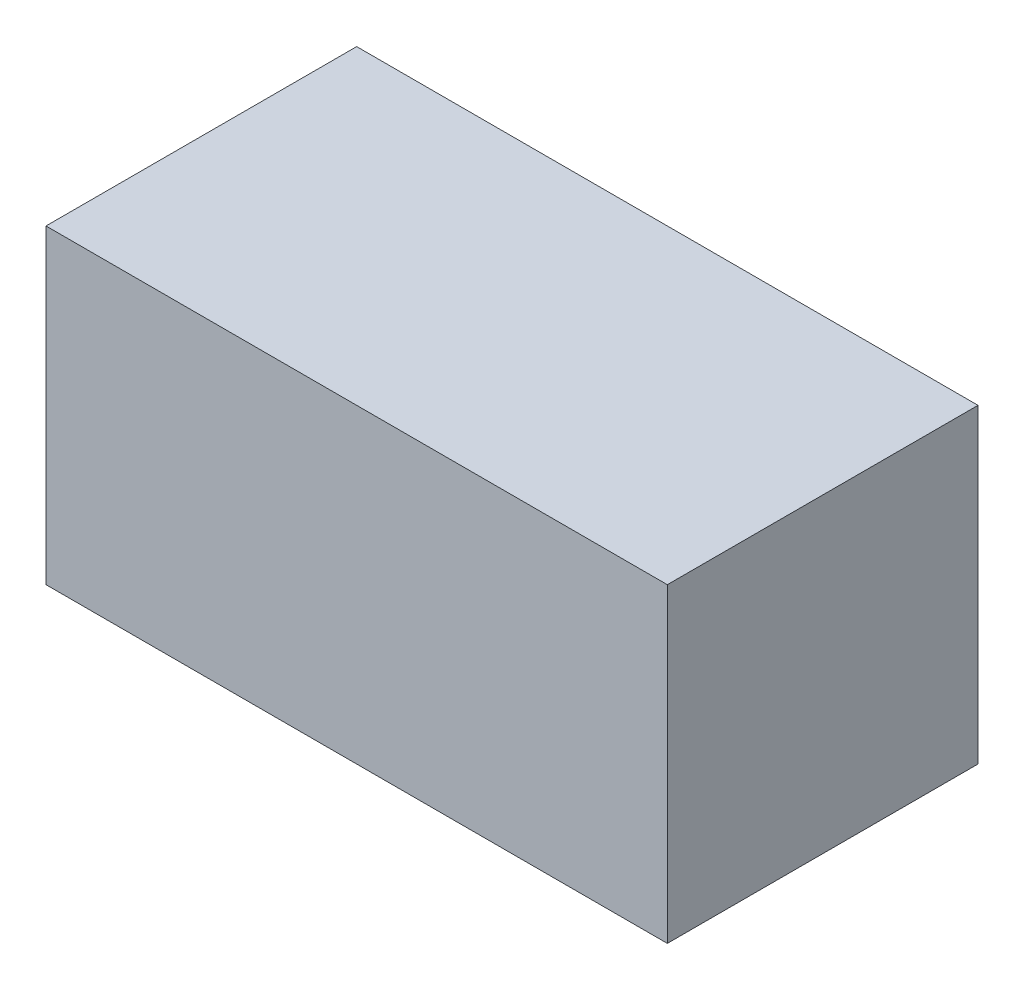
ISO-10303-21;
HEADER;
FILE_DESCRIPTION(('STEP AP214'),'2;1');
FILE_NAME('part.step','',(''),(''),'','','');
FILE_SCHEMA(('AUTOMOTIVE_DESIGN { 1 0 10303 214 1 1 1 1 }'));
ENDSEC;
DATA;
#1=APPLICATION_CONTEXT('core data for automotive mechanical design processes');
#2=APPLICATION_PROTOCOL_DEFINITION('international standard','automotive_design',2000,#1);
#3=PRODUCT_CONTEXT('',#1,'mechanical');
#4=PRODUCT('Part','Part','',(#3));
#5=PRODUCT_RELATED_PRODUCT_CATEGORY('part','',(#4));
#6=PRODUCT_DEFINITION_FORMATION('','',#4);
#7=PRODUCT_DEFINITION_CONTEXT('part definition',#1,'design');
#8=PRODUCT_DEFINITION('design','',#6,#7);
#9=PRODUCT_DEFINITION_SHAPE('','',#8);
#10=(LENGTH_UNIT() NAMED_UNIT(*) SI_UNIT(.MILLI.,.METRE.));
#11=(NAMED_UNIT(*) PLANE_ANGLE_UNIT() SI_UNIT($,.RADIAN.));
#12=(NAMED_UNIT(*) SI_UNIT($,.STERADIAN.) SOLID_ANGLE_UNIT());
#13=UNCERTAINTY_MEASURE_WITH_UNIT(LENGTH_MEASURE(1.E-05),#10,'distance_accuracy_value','');
#14=(GEOMETRIC_REPRESENTATION_CONTEXT(3) GLOBAL_UNCERTAINTY_ASSIGNED_CONTEXT((#13)) GLOBAL_UNIT_ASSIGNED_CONTEXT((#10,
#11,#12)) REPRESENTATION_CONTEXT('',''));
#15=CARTESIAN_POINT('',(0.,0.,0.));
#16=DIRECTION('',(0.,0.,1.));
#17=DIRECTION('',(1.,0.,0.));
#18=AXIS2_PLACEMENT_3D('',#15,#16,#17);
#19=CARTESIAN_POINT('',(-6.35,-6.35,-3.175));
#20=DIRECTION('',(-1.,0.,0.));
#21=DIRECTION('',(0.,0.,1.));
#22=AXIS2_PLACEMENT_3D('',#19,#20,#21);
#23=PLANE('',#22);
#24=DIRECTION('',(0.,0.,1.));
#25=VECTOR('',#24,1.);
#26=CARTESIAN_POINT('',(-6.35,0.,-3.175));
#27=LINE('',#26,#25);
#28=CARTESIAN_POINT('',(-6.35,0.,-3.175));
#29=VERTEX_POINT('',#28);
#30=CARTESIAN_POINT('',(-6.35,0.,3.175));
#31=VERTEX_POINT('',#30);
#32=EDGE_CURVE('E99',#29,#31,#27,.T.);
#33=ORIENTED_EDGE('',*,*,#32,.F.);
#34=DIRECTION('',(0.,1.,0.));
#35=VECTOR('',#34,1.);
#36=CARTESIAN_POINT('',(-6.35,-6.35,-3.175));
#37=LINE('',#36,#35);
#38=CARTESIAN_POINT('',(-6.35,-6.35,-3.175));
#39=VERTEX_POINT('',#38);
#40=EDGE_CURVE('E11',#39,#29,#37,.T.);
#41=ORIENTED_EDGE('',*,*,#40,.F.);
#42=DIRECTION('',(0.,0.,1.));
#43=VECTOR('',#42,1.);
#44=CARTESIAN_POINT('',(-6.35,-6.35,-3.175));
#45=LINE('',#44,#43);
#46=CARTESIAN_POINT('',(-6.35,-6.35,3.175));
#47=VERTEX_POINT('',#46);
#48=EDGE_CURVE('E93',#39,#47,#45,.T.);
#49=ORIENTED_EDGE('',*,*,#48,.T.);
#50=DIRECTION('',(0.,1.,0.));
#51=VECTOR('',#50,1.);
#52=CARTESIAN_POINT('',(-6.35,-6.35,3.175));
#53=LINE('',#52,#51);
#54=EDGE_CURVE('E38',#47,#31,#53,.T.);
#55=ORIENTED_EDGE('',*,*,#54,.T.);
#56=EDGE_LOOP('',(#33,#41,#49,#55));
#57=FACE_BOUND('',#56,.T.);
#58=ADVANCED_FACE('F35',(#57),#23,.T.);
#59=CARTESIAN_POINT('',(-6.35,-6.35,-3.175));
#60=DIRECTION('',(0.,0.,-1.));
#61=DIRECTION('',(-1.,0.,0.));
#62=AXIS2_PLACEMENT_3D('',#59,#60,#61);
#63=PLANE('',#62);
#64=DIRECTION('',(-1.,0.,0.));
#65=VECTOR('',#64,1.);
#66=CARTESIAN_POINT('',(-6.35,0.,-3.175));
#67=LINE('',#66,#65);
#68=CARTESIAN_POINT('',(6.35,0.,-3.175));
#69=VERTEX_POINT('',#68);
#70=EDGE_CURVE('E95',#69,#29,#67,.T.);
#71=ORIENTED_EDGE('',*,*,#70,.F.);
#72=DIRECTION('',(0.,1.,0.));
#73=VECTOR('',#72,1.);
#74=CARTESIAN_POINT('',(6.35,-6.35,-3.175));
#75=LINE('',#74,#73);
#76=CARTESIAN_POINT('',(6.35,-6.35,-3.175));
#77=VERTEX_POINT('',#76);
#78=EDGE_CURVE('E44',#77,#69,#75,.T.);
#79=ORIENTED_EDGE('',*,*,#78,.F.);
#80=DIRECTION('',(-1.,0.,0.));
#81=VECTOR('',#80,1.);
#82=CARTESIAN_POINT('',(-6.35,-6.35,-3.175));
#83=LINE('',#82,#81);
#84=EDGE_CURVE('E90',#77,#39,#83,.T.);
#85=ORIENTED_EDGE('',*,*,#84,.T.);
#86=ORIENTED_EDGE('',*,*,#40,.T.);
#87=EDGE_LOOP('',(#71,#79,#85,#86));
#88=FACE_BOUND('',#87,.T.);
#89=ADVANCED_FACE('F109',(#88),#63,.T.);
#90=CARTESIAN_POINT('',(6.35,-6.35,-3.175));
#91=DIRECTION('',(1.,0.,0.));
#92=DIRECTION('',(0.,0.,-1.));
#93=AXIS2_PLACEMENT_3D('',#90,#91,#92);
#94=PLANE('',#93);
#95=DIRECTION('',(0.,0.,-1.));
#96=VECTOR('',#95,1.);
#97=CARTESIAN_POINT('',(6.35,0.,-3.175));
#98=LINE('',#97,#96);
#99=CARTESIAN_POINT('',(6.35,0.,3.175));
#100=VERTEX_POINT('',#99);
#101=EDGE_CURVE('E85',#100,#69,#98,.T.);
#102=ORIENTED_EDGE('',*,*,#101,.F.);
#103=DIRECTION('',(0.,1.,0.));
#104=VECTOR('',#103,1.);
#105=CARTESIAN_POINT('',(6.35,-6.35,3.175));
#106=LINE('',#105,#104);
#107=CARTESIAN_POINT('',(6.35,-6.35,3.175));
#108=VERTEX_POINT('',#107);
#109=EDGE_CURVE('E80',#108,#100,#106,.T.);
#110=ORIENTED_EDGE('',*,*,#109,.F.);
#111=DIRECTION('',(0.,0.,-1.));
#112=VECTOR('',#111,1.);
#113=CARTESIAN_POINT('',(6.35,-6.35,-3.175));
#114=LINE('',#113,#112);
#115=EDGE_CURVE('E83',#108,#77,#114,.T.);
#116=ORIENTED_EDGE('',*,*,#115,.T.);
#117=ORIENTED_EDGE('',*,*,#78,.T.);
#118=EDGE_LOOP('',(#102,#110,#116,#117));
#119=FACE_BOUND('',#118,.T.);
#120=ADVANCED_FACE('F82',(#119),#94,.T.);
#121=CARTESIAN_POINT('',(-6.35,-6.35,3.175));
#122=DIRECTION('',(0.,0.,1.));
#123=DIRECTION('',(1.,0.,0.));
#124=AXIS2_PLACEMENT_3D('',#121,#122,#123);
#125=PLANE('',#124);
#126=DIRECTION('',(1.,0.,0.));
#127=VECTOR('',#126,1.);
#128=CARTESIAN_POINT('',(-6.35,0.,3.175));
#129=LINE('',#128,#127);
#130=EDGE_CURVE('E102',#31,#100,#129,.T.);
#131=ORIENTED_EDGE('',*,*,#130,.F.);
#132=ORIENTED_EDGE('',*,*,#54,.F.);
#133=DIRECTION('',(1.,0.,0.));
#134=VECTOR('',#133,1.);
#135=CARTESIAN_POINT('',(-6.35,-6.35,3.175));
#136=LINE('',#135,#134);
#137=EDGE_CURVE('E89',#47,#108,#136,.T.);
#138=ORIENTED_EDGE('',*,*,#137,.T.);
#139=ORIENTED_EDGE('',*,*,#109,.T.);
#140=EDGE_LOOP('',(#131,#132,#138,#139));
#141=FACE_BOUND('',#140,.T.);
#142=ADVANCED_FACE('F92',(#141),#125,.T.);
#143=CARTESIAN_POINT('',(-6.35,-6.35,3.175));
#144=DIRECTION('',(0.,1.,0.));
#145=DIRECTION('',(0.,0.,1.));
#146=AXIS2_PLACEMENT_3D('',#143,#144,#145);
#147=PLANE('',#146);
#148=ORIENTED_EDGE('',*,*,#48,.F.);
#149=ORIENTED_EDGE('',*,*,#84,.F.);
#150=ORIENTED_EDGE('',*,*,#115,.F.);
#151=ORIENTED_EDGE('',*,*,#137,.F.);
#152=EDGE_LOOP('',(#148,#149,#150,#151));
#153=FACE_BOUND('',#152,.T.);
#154=ADVANCED_FACE('F88',(#153),#147,.F.);
#155=CARTESIAN_POINT('',(-6.35,0.,3.175));
#156=DIRECTION('',(0.,1.,0.));
#157=DIRECTION('',(0.,0.,1.));
#158=AXIS2_PLACEMENT_3D('',#155,#156,#157);
#159=PLANE('',#158);
#160=ORIENTED_EDGE('',*,*,#32,.T.);
#161=ORIENTED_EDGE('',*,*,#130,.T.);
#162=ORIENTED_EDGE('',*,*,#101,.T.);
#163=ORIENTED_EDGE('',*,*,#70,.T.);
#164=EDGE_LOOP('',(#160,#161,#162,#163));
#165=FACE_BOUND('',#164,.T.);
#166=ADVANCED_FACE('F108',(#165),#159,.T.);
#167=CLOSED_SHELL('',(#58,#89,#120,#142,#154,#166));
#168=MANIFOLD_SOLID_BREP('B2',#167);
#169=ADVANCED_BREP_SHAPE_REPRESENTATION('',(#18,#168),#14);
#170=SHAPE_DEFINITION_REPRESENTATION(#9,#169);
ENDSEC;
END-ISO-10303-21;
